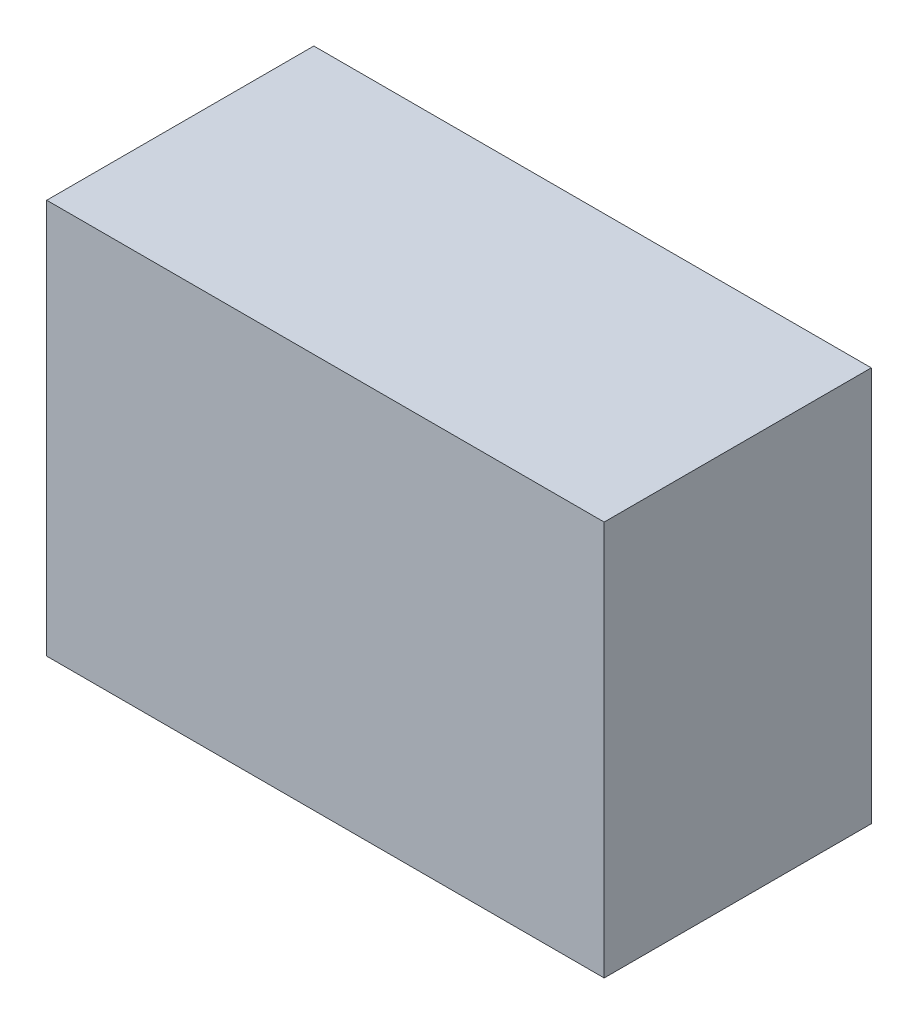
ISO-10303-21;
HEADER;
FILE_DESCRIPTION(('STEP AP214'),'2;1');
FILE_NAME('part.step','',(''),(''),'','','');
FILE_SCHEMA(('AUTOMOTIVE_DESIGN { 1 0 10303 214 1 1 1 1 }'));
ENDSEC;
DATA;
#1=APPLICATION_CONTEXT('core data for automotive mechanical design processes');
#2=APPLICATION_PROTOCOL_DEFINITION('international standard','automotive_design',2000,#1);
#3=PRODUCT_CONTEXT('',#1,'mechanical');
#4=PRODUCT('Part','Part','',(#3));
#5=PRODUCT_RELATED_PRODUCT_CATEGORY('part','',(#4));
#6=PRODUCT_DEFINITION_FORMATION('','',#4);
#7=PRODUCT_DEFINITION_CONTEXT('part definition',#1,'design');
#8=PRODUCT_DEFINITION('design','',#6,#7);
#9=PRODUCT_DEFINITION_SHAPE('','',#8);
#10=(LENGTH_UNIT() NAMED_UNIT(*) SI_UNIT(.MILLI.,.METRE.));
#11=(NAMED_UNIT(*) PLANE_ANGLE_UNIT() SI_UNIT($,.RADIAN.));
#12=(NAMED_UNIT(*) SI_UNIT($,.STERADIAN.) SOLID_ANGLE_UNIT());
#13=UNCERTAINTY_MEASURE_WITH_UNIT(LENGTH_MEASURE(1.E-05),#10,'distance_accuracy_value','');
#14=(GEOMETRIC_REPRESENTATION_CONTEXT(3) GLOBAL_UNCERTAINTY_ASSIGNED_CONTEXT((#13)) GLOBAL_UNIT_ASSIGNED_CONTEXT((#10,
#11,#12)) REPRESENTATION_CONTEXT('',''));
#15=CARTESIAN_POINT('',(0.,0.,0.));
#16=DIRECTION('',(0.,0.,1.));
#17=DIRECTION('',(1.,0.,0.));
#18=AXIS2_PLACEMENT_3D('',#15,#16,#17);
#19=CARTESIAN_POINT('',(1.1499,3.6812,1.93));
#20=DIRECTION('',(1.,0.,0.));
#21=DIRECTION('',(0.,1.,0.));
#22=AXIS2_PLACEMENT_3D('',#19,#20,#21);
#23=PLANE('',#22);
#24=DIRECTION('',(0.,0.,1.));
#25=VECTOR('',#24,1.);
#26=CARTESIAN_POINT('',(1.14990000001,3.34120000001,1.70000000001));
#27=LINE('',#26,#25);
#28=CARTESIAN_POINT('',(1.1499,3.3412,1.7));
#29=VERTEX_POINT('',#28);
#30=CARTESIAN_POINT('',(1.1499,3.3412,1.93));
#31=VERTEX_POINT('',#30);
#32=EDGE_CURVE('E11',#29,#31,#27,.T.);
#33=ORIENTED_EDGE('',*,*,#32,.T.);
#34=DIRECTION('',(0.,1.,0.));
#35=VECTOR('',#34,1.);
#36=CARTESIAN_POINT('',(1.14990000001,3.34120000001,1.93000000001));
#37=LINE('',#36,#35);
#38=CARTESIAN_POINT('',(1.1499,3.6812,1.93));
#39=VERTEX_POINT('',#38);
#40=EDGE_CURVE('E90',#31,#39,#37,.T.);
#41=ORIENTED_EDGE('',*,*,#40,.T.);
#42=DIRECTION('',(0.,0.,1.));
#43=VECTOR('',#42,1.);
#44=CARTESIAN_POINT('',(1.14990000001,3.68120000001,1.70000000001));
#45=LINE('',#44,#43);
#46=CARTESIAN_POINT('',(1.1499,3.6812,1.7));
#47=VERTEX_POINT('',#46);
#48=EDGE_CURVE('E66',#47,#39,#45,.T.);
#49=ORIENTED_EDGE('',*,*,#48,.F.);
#50=DIRECTION('',(0.,1.,0.));
#51=VECTOR('',#50,1.);
#52=CARTESIAN_POINT('',(1.14990000001,3.34120000001,1.70000000001));
#53=LINE('',#52,#51);
#54=EDGE_CURVE('E64',#29,#47,#53,.T.);
#55=ORIENTED_EDGE('',*,*,#54,.F.);
#56=EDGE_LOOP('',(#33,#41,#49,#55));
#57=FACE_BOUND('',#56,.T.);
#58=ADVANCED_FACE('F17',(#57),#23,.F.);
#59=CARTESIAN_POINT('',(1.6299,3.3412,1.93));
#60=DIRECTION('',(0.,-1.,0.));
#61=DIRECTION('',(0.,0.,-1.));
#62=AXIS2_PLACEMENT_3D('',#59,#60,#61);
#63=PLANE('',#62);
#64=DIRECTION('',(0.,0.,1.));
#65=VECTOR('',#64,1.);
#66=CARTESIAN_POINT('',(1.62990000001,3.34120000001,1.70000000001));
#67=LINE('',#66,#65);
#68=CARTESIAN_POINT('',(1.6299,3.3412,1.7));
#69=VERTEX_POINT('',#68);
#70=CARTESIAN_POINT('',(1.6299,3.3412,1.93));
#71=VERTEX_POINT('',#70);
#72=EDGE_CURVE('E83',#69,#71,#67,.T.);
#73=ORIENTED_EDGE('',*,*,#72,.T.);
#74=DIRECTION('',(1.,0.,0.));
#75=VECTOR('',#74,1.);
#76=CARTESIAN_POINT('',(1.14990000001,3.34120000001,1.93000000001));
#77=LINE('',#76,#75);
#78=EDGE_CURVE('E26',#31,#71,#77,.T.);
#79=ORIENTED_EDGE('',*,*,#78,.F.);
#80=ORIENTED_EDGE('',*,*,#32,.F.);
#81=DIRECTION('',(1.,0.,0.));
#82=VECTOR('',#81,1.);
#83=CARTESIAN_POINT('',(1.14990000001,3.34120000001,1.70000000001));
#84=LINE('',#83,#82);
#85=EDGE_CURVE('E60',#29,#69,#84,.T.);
#86=ORIENTED_EDGE('',*,*,#85,.T.);
#87=EDGE_LOOP('',(#73,#79,#80,#86));
#88=FACE_BOUND('',#87,.T.);
#89=ADVANCED_FACE('F58',(#88),#63,.T.);
#90=CARTESIAN_POINT('',(1.6299,3.3412,1.93));
#91=DIRECTION('',(0.,0.,-1.));
#92=DIRECTION('',(0.,-1.,0.));
#93=AXIS2_PLACEMENT_3D('',#90,#91,#92);
#94=PLANE('',#93);
#95=DIRECTION('',(1.,0.,0.));
#96=VECTOR('',#95,1.);
#97=CARTESIAN_POINT('',(1.14990000001,3.68120000001,1.93000000001));
#98=LINE('',#97,#96);
#99=CARTESIAN_POINT('',(1.6299,3.6812,1.93));
#100=VERTEX_POINT('',#99);
#101=EDGE_CURVE('E87',#39,#100,#98,.T.);
#102=ORIENTED_EDGE('',*,*,#101,.F.);
#103=ORIENTED_EDGE('',*,*,#40,.F.);
#104=ORIENTED_EDGE('',*,*,#78,.T.);
#105=DIRECTION('',(0.,1.,0.));
#106=VECTOR('',#105,1.);
#107=CARTESIAN_POINT('',(1.62990000001,3.34120000001,1.93000000001));
#108=LINE('',#107,#106);
#109=EDGE_CURVE('E103',#71,#100,#108,.T.);
#110=ORIENTED_EDGE('',*,*,#109,.T.);
#111=EDGE_LOOP('',(#102,#103,#104,#110));
#112=FACE_BOUND('',#111,.T.);
#113=ADVANCED_FACE('F173',(#112),#94,.F.);
#114=CARTESIAN_POINT('',(1.6299,3.6812,1.93));
#115=DIRECTION('',(0.,-1.,0.));
#116=DIRECTION('',(0.,0.,-1.));
#117=AXIS2_PLACEMENT_3D('',#114,#115,#116);
#118=PLANE('',#117);
#119=ORIENTED_EDGE('',*,*,#48,.T.);
#120=ORIENTED_EDGE('',*,*,#101,.T.);
#121=DIRECTION('',(0.,0.,1.));
#122=VECTOR('',#121,1.);
#123=CARTESIAN_POINT('',(1.62990000001,3.68120000001,1.70000000001));
#124=LINE('',#123,#122);
#125=CARTESIAN_POINT('',(1.6299,3.6812,1.7));
#126=VERTEX_POINT('',#125);
#127=EDGE_CURVE('E115',#126,#100,#124,.T.);
#128=ORIENTED_EDGE('',*,*,#127,.F.);
#129=DIRECTION('',(1.,0.,0.));
#130=VECTOR('',#129,1.);
#131=CARTESIAN_POINT('',(1.14990000001,3.68120000001,1.70000000001));
#132=LINE('',#131,#130);
#133=EDGE_CURVE('E71',#47,#126,#132,.T.);
#134=ORIENTED_EDGE('',*,*,#133,.F.);
#135=EDGE_LOOP('',(#119,#120,#128,#134));
#136=FACE_BOUND('',#135,.T.);
#137=ADVANCED_FACE('F111',(#136),#118,.F.);
#138=CARTESIAN_POINT('',(1.6299,3.3412,1.7));
#139=DIRECTION('',(0.,0.,-1.));
#140=DIRECTION('',(0.,-1.,0.));
#141=AXIS2_PLACEMENT_3D('',#138,#139,#140);
#142=PLANE('',#141);
#143=ORIENTED_EDGE('',*,*,#85,.F.);
#144=ORIENTED_EDGE('',*,*,#54,.T.);
#145=ORIENTED_EDGE('',*,*,#133,.T.);
#146=DIRECTION('',(0.,1.,0.));
#147=VECTOR('',#146,1.);
#148=CARTESIAN_POINT('',(1.62990000001,3.34120000001,1.70000000001));
#149=LINE('',#148,#147);
#150=EDGE_CURVE('E75',#69,#126,#149,.T.);
#151=ORIENTED_EDGE('',*,*,#150,.F.);
#152=EDGE_LOOP('',(#143,#144,#145,#151));
#153=FACE_BOUND('',#152,.T.);
#154=ADVANCED_FACE('F73',(#153),#142,.T.);
#155=CARTESIAN_POINT('',(1.6299,3.6812,1.93));
#156=DIRECTION('',(1.,0.,0.));
#157=DIRECTION('',(0.,1.,0.));
#158=AXIS2_PLACEMENT_3D('',#155,#156,#157);
#159=PLANE('',#158);
#160=ORIENTED_EDGE('',*,*,#127,.T.);
#161=ORIENTED_EDGE('',*,*,#109,.F.);
#162=ORIENTED_EDGE('',*,*,#72,.F.);
#163=ORIENTED_EDGE('',*,*,#150,.T.);
#164=EDGE_LOOP('',(#160,#161,#162,#163));
#165=FACE_BOUND('',#164,.T.);
#166=ADVANCED_FACE('F118',(#165),#159,.T.);
#167=CLOSED_SHELL('',(#58,#89,#113,#137,#154,#166));
#168=MANIFOLD_SOLID_BREP('B1',#167);
#169=ADVANCED_BREP_SHAPE_REPRESENTATION('',(#18,#168),#14);
#170=SHAPE_DEFINITION_REPRESENTATION(#9,#169);
ENDSEC;
END-ISO-10303-21;
